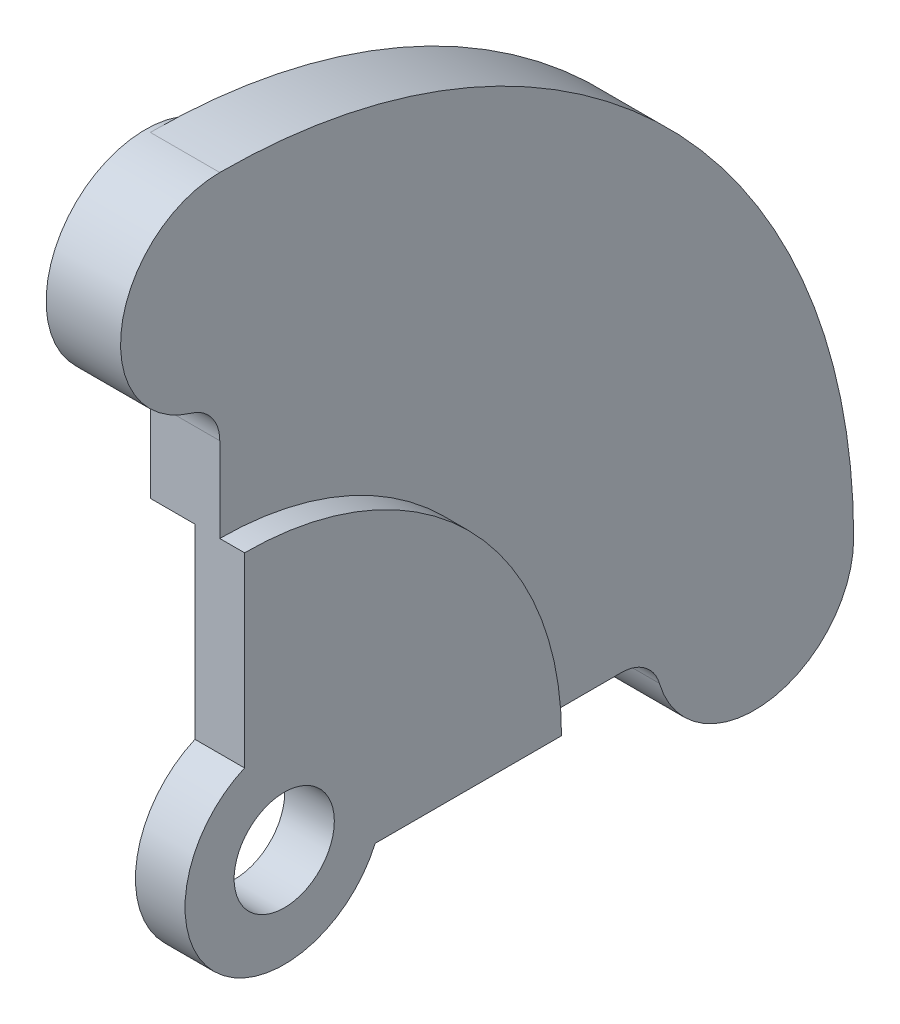
ISO-10303-21;
HEADER;
FILE_DESCRIPTION(('STEP AP214'),'2;1');
FILE_NAME('part.step','',(''),(''),'','','');
FILE_SCHEMA(('AUTOMOTIVE_DESIGN { 1 0 10303 214 1 1 1 1 }'));
ENDSEC;
DATA;
#1=APPLICATION_CONTEXT('core data for automotive mechanical design processes');
#2=APPLICATION_PROTOCOL_DEFINITION('international standard','automotive_design',2000,#1);
#3=PRODUCT_CONTEXT('',#1,'mechanical');
#4=PRODUCT('Part','Part','',(#3));
#5=PRODUCT_RELATED_PRODUCT_CATEGORY('part','',(#4));
#6=PRODUCT_DEFINITION_FORMATION('','',#4);
#7=PRODUCT_DEFINITION_CONTEXT('part definition',#1,'design');
#8=PRODUCT_DEFINITION('design','',#6,#7);
#9=PRODUCT_DEFINITION_SHAPE('','',#8);
#10=(LENGTH_UNIT() NAMED_UNIT(*) SI_UNIT(.MILLI.,.METRE.));
#11=(NAMED_UNIT(*) PLANE_ANGLE_UNIT() SI_UNIT($,.RADIAN.));
#12=(NAMED_UNIT(*) SI_UNIT($,.STERADIAN.) SOLID_ANGLE_UNIT());
#13=UNCERTAINTY_MEASURE_WITH_UNIT(LENGTH_MEASURE(1.E-05),#10,'distance_accuracy_value','');
#14=(GEOMETRIC_REPRESENTATION_CONTEXT(3) GLOBAL_UNCERTAINTY_ASSIGNED_CONTEXT((#13)) GLOBAL_UNIT_ASSIGNED_CONTEXT((#10,
#11,#12)) REPRESENTATION_CONTEXT('',''));
#15=CARTESIAN_POINT('',(0.,0.,0.));
#16=DIRECTION('',(0.,0.,1.));
#17=DIRECTION('',(1.,0.,0.));
#18=AXIS2_PLACEMENT_3D('',#15,#16,#17);
#19=CARTESIAN_POINT('',(2.5,0.,0.));
#20=DIRECTION('',(0.,1.,0.));
#21=DIRECTION('',(0.,0.,1.));
#22=AXIS2_PLACEMENT_3D('',#19,#20,#21);
#23=PLANE('',#22);
#24=DIRECTION('',(0.,0.,-1.));
#25=VECTOR('',#24,1.);
#26=CARTESIAN_POINT('',(2.5,0.,0.));
#27=LINE('',#26,#25);
#28=CARTESIAN_POINT('',(2.5,0.,-13.1651513899117));
#29=VERTEX_POINT('',#28);
#30=CARTESIAN_POINT('',(2.5,0.,-31.95));
#31=VERTEX_POINT('',#30);
#32=EDGE_CURVE('E156',#29,#31,#27,.T.);
#33=ORIENTED_EDGE('',*,*,#32,.F.);
#34=DIRECTION('',(1.,0.,0.));
#35=VECTOR('',#34,1.);
#36=CARTESIAN_POINT('',(-30.7842712474619,0.,-13.1651513899117));
#37=LINE('',#36,#35);
#38=CARTESIAN_POINT('',(-2.5,0.,-13.1651513899117));
#39=VERTEX_POINT('',#38);
#40=EDGE_CURVE('E141',#29,#39,#37,.F.);
#41=ORIENTED_EDGE('',*,*,#40,.T.);
#42=DIRECTION('',(0.,0.,-1.));
#43=VECTOR('',#42,1.);
#44=CARTESIAN_POINT('',(-2.5,0.,0.));
#45=LINE('',#44,#43);
#46=CARTESIAN_POINT('',(-2.5,0.,-31.95));
#47=VERTEX_POINT('',#46);
#48=EDGE_CURVE('E153',#39,#47,#45,.T.);
#49=ORIENTED_EDGE('',*,*,#48,.T.);
#50=DIRECTION('',(1.,0.,0.));
#51=VECTOR('',#50,1.);
#52=CARTESIAN_POINT('',(-7.,0.,-31.95));
#53=LINE('',#52,#51);
#54=CARTESIAN_POINT('',(-7.,0.,-31.95));
#55=VERTEX_POINT('',#54);
#56=EDGE_CURVE('E217',#55,#47,#53,.T.);
#57=ORIENTED_EDGE('',*,*,#56,.F.);
#58=DIRECTION('',(0.,0.,-1.));
#59=VECTOR('',#58,1.);
#60=CARTESIAN_POINT('',(-7.,0.,0.));
#61=LINE('',#60,#59);
#62=CARTESIAN_POINT('',(-7.,0.,-40.4835921350013));
#63=VERTEX_POINT('',#62);
#64=EDGE_CURVE('E256',#55,#63,#61,.T.);
#65=ORIENTED_EDGE('',*,*,#64,.T.);
#66=DIRECTION('',(1.,0.,0.));
#67=VECTOR('',#66,1.);
#68=CARTESIAN_POINT('',(2.5,0.,-40.4835921350013));
#69=LINE('',#68,#67);
#70=CARTESIAN_POINT('',(0.,0.,-40.4835921350013));
#71=VERTEX_POINT('',#70);
#72=EDGE_CURVE('E187',#63,#71,#69,.T.);
#73=ORIENTED_EDGE('',*,*,#72,.T.);
#74=DIRECTION('',(0.,0.,-1.));
#75=VECTOR('',#74,1.);
#76=CARTESIAN_POINT('',(0.,0.,0.));
#77=LINE('',#76,#75);
#78=CARTESIAN_POINT('',(0.,0.,-31.95));
#79=VERTEX_POINT('',#78);
#80=EDGE_CURVE('E235',#79,#71,#77,.T.);
#81=ORIENTED_EDGE('',*,*,#80,.F.);
#82=DIRECTION('',(-1.,0.,0.));
#83=VECTOR('',#82,1.);
#84=CARTESIAN_POINT('',(2.5,0.,-31.95));
#85=LINE('',#84,#83);
#86=EDGE_CURVE('E184',#31,#79,#85,.T.);
#87=ORIENTED_EDGE('',*,*,#86,.F.);
#88=EDGE_LOOP('',(#33,#41,#49,#57,#65,#73,#81,#87));
#89=FACE_BOUND('',#88,.T.);
#90=ADVANCED_FACE('F49',(#89),#23,.F.);
#91=CARTESIAN_POINT('',(2.5,0.,0.));
#92=DIRECTION('',(-1.,0.,0.));
#93=DIRECTION('',(0.,0.,1.));
#94=AXIS2_PLACEMENT_3D('',#91,#92,#93);
#95=CYLINDRICAL_SURFACE('',#94,31.95);
#96=ORIENTED_EDGE('',*,*,#86,.T.);
#97=CARTESIAN_POINT('',(0.,0.,0.));
#98=DIRECTION('',(1.,0.,0.));
#99=DIRECTION('',(0.,0.,-1.));
#100=AXIS2_PLACEMENT_3D('',#97,#98,#99);
#101=CIRCLE('',#100,31.95);
#102=CARTESIAN_POINT('',(0.,31.95,0.));
#103=VERTEX_POINT('',#102);
#104=EDGE_CURVE('E239',#79,#103,#101,.T.);
#105=ORIENTED_EDGE('',*,*,#104,.T.);
#106=DIRECTION('',(-1.,0.,0.));
#107=VECTOR('',#106,1.);
#108=CARTESIAN_POINT('',(2.5,31.95,0.));
#109=LINE('',#108,#107);
#110=CARTESIAN_POINT('',(2.5,31.95,0.));
#111=VERTEX_POINT('',#110);
#112=EDGE_CURVE('E180',#111,#103,#109,.T.);
#113=ORIENTED_EDGE('',*,*,#112,.F.);
#114=CARTESIAN_POINT('',(2.5,0.,0.));
#115=DIRECTION('',(1.,0.,0.));
#116=DIRECTION('',(0.,0.,-1.));
#117=AXIS2_PLACEMENT_3D('',#114,#115,#116);
#118=CIRCLE('',#117,31.95);
#119=EDGE_CURVE('E211',#31,#111,#118,.T.);
#120=ORIENTED_EDGE('',*,*,#119,.F.);
#121=EDGE_LOOP('',(#96,#105,#113,#120));
#122=FACE_BOUND('',#121,.T.);
#123=ADVANCED_FACE('F298',(#122),#95,.T.);
#124=CARTESIAN_POINT('',(2.5,0.,0.));
#125=DIRECTION('',(0.,0.,-1.));
#126=DIRECTION('',(-1.,0.,0.));
#127=AXIS2_PLACEMENT_3D('',#124,#125,#126);
#128=PLANE('',#127);
#129=DIRECTION('',(0.,-1.,0.));
#130=VECTOR('',#129,1.);
#131=CARTESIAN_POINT('',(-2.5,0.,0.));
#132=LINE('',#131,#130);
#133=CARTESIAN_POINT('',(-2.5,31.95,0.));
#134=VERTEX_POINT('',#133);
#135=CARTESIAN_POINT('',(-2.5,13.1651513899117,0.));
#136=VERTEX_POINT('',#135);
#137=EDGE_CURVE('E169',#134,#136,#132,.T.);
#138=ORIENTED_EDGE('',*,*,#137,.T.);
#139=DIRECTION('',(1.,0.,0.));
#140=VECTOR('',#139,1.);
#141=CARTESIAN_POINT('',(-30.7842712474619,13.1651513899117,0.));
#142=LINE('',#141,#140);
#143=CARTESIAN_POINT('',(2.5,13.1651513899117,0.));
#144=VERTEX_POINT('',#143);
#145=EDGE_CURVE('E144',#136,#144,#142,.T.);
#146=ORIENTED_EDGE('',*,*,#145,.T.);
#147=DIRECTION('',(0.,-1.,0.));
#148=VECTOR('',#147,1.);
#149=CARTESIAN_POINT('',(2.5,0.,0.));
#150=LINE('',#149,#148);
#151=EDGE_CURVE('E175',#111,#144,#150,.T.);
#152=ORIENTED_EDGE('',*,*,#151,.F.);
#153=ORIENTED_EDGE('',*,*,#112,.T.);
#154=DIRECTION('',(0.,-1.,0.));
#155=VECTOR('',#154,1.);
#156=CARTESIAN_POINT('',(0.,0.,0.));
#157=LINE('',#156,#155);
#158=CARTESIAN_POINT('',(0.,40.4835921350013,0.));
#159=VERTEX_POINT('',#158);
#160=EDGE_CURVE('E228',#159,#103,#157,.T.);
#161=ORIENTED_EDGE('',*,*,#160,.F.);
#162=DIRECTION('',(1.,0.,0.));
#163=VECTOR('',#162,1.);
#164=CARTESIAN_POINT('',(2.5,40.4835921350013,0.));
#165=LINE('',#164,#163);
#166=CARTESIAN_POINT('',(-7.,40.4835921350013,0.));
#167=VERTEX_POINT('',#166);
#168=EDGE_CURVE('E66',#159,#167,#165,.F.);
#169=ORIENTED_EDGE('',*,*,#168,.T.);
#170=DIRECTION('',(0.,-1.,0.));
#171=VECTOR('',#170,1.);
#172=CARTESIAN_POINT('',(-7.,0.,0.));
#173=LINE('',#172,#171);
#174=CARTESIAN_POINT('',(-7.,31.95,0.));
#175=VERTEX_POINT('',#174);
#176=EDGE_CURVE('E221',#167,#175,#173,.T.);
#177=ORIENTED_EDGE('',*,*,#176,.T.);
#178=DIRECTION('',(1.,0.,0.));
#179=VECTOR('',#178,1.);
#180=CARTESIAN_POINT('',(-7.,31.95,0.));
#181=LINE('',#180,#179);
#182=EDGE_CURVE('E165',#175,#134,#181,.T.);
#183=ORIENTED_EDGE('',*,*,#182,.T.);
#184=EDGE_LOOP('',(#138,#146,#152,#153,#161,#169,#177,#183));
#185=FACE_BOUND('',#184,.T.);
#186=ADVANCED_FACE('F305',(#185),#128,.F.);
#187=CARTESIAN_POINT('',(2.5,0.,0.));
#188=DIRECTION('',(1.,0.,0.));
#189=DIRECTION('',(0.,0.,-1.));
#190=AXIS2_PLACEMENT_3D('',#187,#188,#189);
#191=PLANE('',#190);
#192=CARTESIAN_POINT('',(2.5,4.,-4.));
#193=DIRECTION('',(1.,0.,0.));
#194=DIRECTION('',(0.,0.,-1.));
#195=AXIS2_PLACEMENT_3D('',#192,#193,#194);
#196=CIRCLE('',#195,5.05);
#197=CARTESIAN_POINT('',(2.5,4.,-9.05));
#198=VERTEX_POINT('',#197);
#199=EDGE_CURVE('E279',#198,#198,#196,.T.);
#200=ORIENTED_EDGE('',*,*,#199,.F.);
#201=EDGE_LOOP('',(#200));
#202=FACE_BOUND('',#201,.T.);
#203=CARTESIAN_POINT('',(2.5,4.,-4.));
#204=DIRECTION('',(1.,0.,0.));
#205=DIRECTION('',(0.,0.,-1.));
#206=AXIS2_PLACEMENT_3D('',#203,#204,#205);
#207=CIRCLE('',#206,10.);
#208=EDGE_CURVE('E149',#144,#29,#207,.T.);
#209=ORIENTED_EDGE('',*,*,#208,.T.);
#210=ORIENTED_EDGE('',*,*,#32,.T.);
#211=ORIENTED_EDGE('',*,*,#119,.T.);
#212=ORIENTED_EDGE('',*,*,#151,.T.);
#213=EDGE_LOOP('',(#209,#210,#211,#212));
#214=FACE_BOUND('',#213,.T.);
#215=ADVANCED_FACE('F367',(#202,#214),#191,.T.);
#216=CARTESIAN_POINT('',(-2.5,0.,0.));
#217=DIRECTION('',(1.,0.,0.));
#218=DIRECTION('',(0.,0.,-1.));
#219=AXIS2_PLACEMENT_3D('',#216,#217,#218);
#220=PLANE('',#219);
#221=CARTESIAN_POINT('',(-2.5,4.,-4.));
#222=DIRECTION('',(1.,0.,0.));
#223=DIRECTION('',(0.,0.,-1.));
#224=AXIS2_PLACEMENT_3D('',#221,#222,#223);
#225=CIRCLE('',#224,5.05);
#226=CARTESIAN_POINT('',(-2.5,4.,-9.05));
#227=VERTEX_POINT('',#226);
#228=EDGE_CURVE('E53',#227,#227,#225,.T.);
#229=ORIENTED_EDGE('',*,*,#228,.T.);
#230=EDGE_LOOP('',(#229));
#231=FACE_BOUND('',#230,.T.);
#232=ORIENTED_EDGE('',*,*,#48,.F.);
#233=CARTESIAN_POINT('',(-2.5,4.,-4.));
#234=DIRECTION('',(1.,0.,0.));
#235=DIRECTION('',(0.,0.,-1.));
#236=AXIS2_PLACEMENT_3D('',#233,#234,#235);
#237=CIRCLE('',#236,10.);
#238=EDGE_CURVE('E138',#39,#136,#237,.F.);
#239=ORIENTED_EDGE('',*,*,#238,.T.);
#240=ORIENTED_EDGE('',*,*,#137,.F.);
#241=CARTESIAN_POINT('',(-2.5,0.,0.));
#242=DIRECTION('',(1.,0.,0.));
#243=DIRECTION('',(0.,0.,-1.));
#244=AXIS2_PLACEMENT_3D('',#241,#242,#243);
#245=CIRCLE('',#244,31.95);
#246=EDGE_CURVE('E162',#47,#134,#245,.T.);
#247=ORIENTED_EDGE('',*,*,#246,.F.);
#248=EDGE_LOOP('',(#232,#239,#240,#247));
#249=FACE_BOUND('',#248,.T.);
#250=ADVANCED_FACE('F160',(#231,#249),#220,.F.);
#251=CARTESIAN_POINT('',(-7.,0.,0.));
#252=DIRECTION('',(1.,0.,0.));
#253=DIRECTION('',(0.,0.,-1.));
#254=AXIS2_PLACEMENT_3D('',#251,#252,#253);
#255=CYLINDRICAL_SURFACE('',#254,31.95);
#256=ORIENTED_EDGE('',*,*,#56,.T.);
#257=ORIENTED_EDGE('',*,*,#246,.T.);
#258=ORIENTED_EDGE('',*,*,#182,.F.);
#259=CARTESIAN_POINT('',(-7.,0.,0.));
#260=DIRECTION('',(1.,0.,0.));
#261=DIRECTION('',(0.,0.,-1.));
#262=AXIS2_PLACEMENT_3D('',#259,#260,#261);
#263=CIRCLE('',#262,31.95);
#264=EDGE_CURVE('E231',#55,#175,#263,.T.);
#265=ORIENTED_EDGE('',*,*,#264,.F.);
#266=EDGE_LOOP('',(#256,#257,#258,#265));
#267=FACE_BOUND('',#266,.T.);
#268=ADVANCED_FACE('F333',(#267),#255,.F.);
#269=CARTESIAN_POINT('',(-7.,0.,0.));
#270=DIRECTION('',(1.,0.,0.));
#271=DIRECTION('',(0.,0.,-1.));
#272=AXIS2_PLACEMENT_3D('',#269,#270,#271);
#273=CYLINDRICAL_SURFACE('',#272,63.9);
#274=CARTESIAN_POINT('',(0.,0.,0.));
#275=DIRECTION('',(1.,0.,0.));
#276=DIRECTION('',(0.,0.,-1.));
#277=AXIS2_PLACEMENT_3D('',#274,#275,#276);
#278=CIRCLE('',#277,63.9);
#279=CARTESIAN_POINT('',(0.,0.,-63.9));
#280=VERTEX_POINT('',#279);
#281=CARTESIAN_POINT('',(0.,63.9,0.));
#282=VERTEX_POINT('',#281);
#283=EDGE_CURVE('E232',#280,#282,#278,.T.);
#284=ORIENTED_EDGE('',*,*,#283,.F.);
#285=DIRECTION('',(1.,0.,0.));
#286=VECTOR('',#285,1.);
#287=CARTESIAN_POINT('',(-7.,0.,-63.9));
#288=LINE('',#287,#286);
#289=CARTESIAN_POINT('',(-7.,0.,-63.9));
#290=VERTEX_POINT('',#289);
#291=EDGE_CURVE('E220',#290,#280,#288,.T.);
#292=ORIENTED_EDGE('',*,*,#291,.F.);
#293=CARTESIAN_POINT('',(-7.,0.,0.));
#294=DIRECTION('',(1.,0.,0.));
#295=DIRECTION('',(0.,0.,-1.));
#296=AXIS2_PLACEMENT_3D('',#293,#294,#295);
#297=CIRCLE('',#296,63.9);
#298=CARTESIAN_POINT('',(-7.,63.9,0.));
#299=VERTEX_POINT('',#298);
#300=EDGE_CURVE('E249',#290,#299,#297,.T.);
#301=ORIENTED_EDGE('',*,*,#300,.T.);
#302=DIRECTION('',(1.,0.,0.));
#303=VECTOR('',#302,1.);
#304=CARTESIAN_POINT('',(-7.,63.9,0.));
#305=LINE('',#304,#303);
#306=EDGE_CURVE('E172',#299,#282,#305,.T.);
#307=ORIENTED_EDGE('',*,*,#306,.T.);
#308=EDGE_LOOP('',(#284,#292,#301,#307));
#309=FACE_BOUND('',#308,.T.);
#310=ADVANCED_FACE('F345',(#309),#273,.T.);
#311=CARTESIAN_POINT('',(-7.,0.,0.));
#312=DIRECTION('',(1.,0.,0.));
#313=DIRECTION('',(0.,0.,-1.));
#314=AXIS2_PLACEMENT_3D('',#311,#312,#313);
#315=PLANE('',#314);
#316=ORIENTED_EDGE('',*,*,#264,.T.);
#317=ORIENTED_EDGE('',*,*,#176,.F.);
#318=CARTESIAN_POINT('',(-7.,40.4835921350013,4.));
#319=DIRECTION('',(1.,0.,0.));
#320=DIRECTION('',(0.,0.,-1.));
#321=AXIS2_PLACEMENT_3D('',#318,#319,#320);
#322=CIRCLE('',#321,4.);
#323=CARTESIAN_POINT('',(-7.,44.3168515250009,2.85714285714286));
#324=VERTEX_POINT('',#323);
#325=EDGE_CURVE('E11',#167,#324,#322,.T.);
#326=ORIENTED_EDGE('',*,*,#325,.T.);
#327=CARTESIAN_POINT('',(-7.,53.9,0.));
#328=DIRECTION('',(1.,0.,0.));
#329=DIRECTION('',(0.,0.,-1.));
#330=AXIS2_PLACEMENT_3D('',#327,#328,#329);
#331=CIRCLE('',#330,10.);
#332=EDGE_CURVE('E246',#324,#299,#331,.T.);
#333=ORIENTED_EDGE('',*,*,#332,.T.);
#334=ORIENTED_EDGE('',*,*,#300,.F.);
#335=CARTESIAN_POINT('',(-7.,0.,-53.9));
#336=DIRECTION('',(1.,0.,0.));
#337=DIRECTION('',(0.,0.,-1.));
#338=AXIS2_PLACEMENT_3D('',#335,#336,#337);
#339=CIRCLE('',#338,10.);
#340=CARTESIAN_POINT('',(-7.,-2.85714285714286,-44.3168515250009));
#341=VERTEX_POINT('',#340);
#342=EDGE_CURVE('E253',#290,#341,#339,.T.);
#343=ORIENTED_EDGE('',*,*,#342,.T.);
#344=CARTESIAN_POINT('',(-7.,-4.,-40.4835921350013));
#345=DIRECTION('',(1.,0.,0.));
#346=DIRECTION('',(0.,0.,-1.));
#347=AXIS2_PLACEMENT_3D('',#344,#345,#346);
#348=CIRCLE('',#347,4.);
#349=EDGE_CURVE('E204',#341,#63,#348,.T.);
#350=ORIENTED_EDGE('',*,*,#349,.T.);
#351=ORIENTED_EDGE('',*,*,#64,.F.);
#352=EDGE_LOOP('',(#316,#317,#326,#333,#334,#343,#350,#351));
#353=FACE_BOUND('',#352,.T.);
#354=ADVANCED_FACE('F326',(#353),#315,.F.);
#355=CARTESIAN_POINT('',(0.,0.,0.));
#356=DIRECTION('',(1.,0.,0.));
#357=DIRECTION('',(0.,0.,-1.));
#358=AXIS2_PLACEMENT_3D('',#355,#356,#357);
#359=PLANE('',#358);
#360=ORIENTED_EDGE('',*,*,#104,.F.);
#361=ORIENTED_EDGE('',*,*,#80,.T.);
#362=CARTESIAN_POINT('',(0.,-4.,-40.4835921350013));
#363=DIRECTION('',(1.,0.,0.));
#364=DIRECTION('',(0.,0.,-1.));
#365=AXIS2_PLACEMENT_3D('',#362,#363,#364);
#366=CIRCLE('',#365,4.);
#367=CARTESIAN_POINT('',(0.,-2.85714285714286,-44.3168515250009));
#368=VERTEX_POINT('',#367);
#369=EDGE_CURVE('E201',#71,#368,#366,.F.);
#370=ORIENTED_EDGE('',*,*,#369,.T.);
#371=CARTESIAN_POINT('',(0.,0.,-53.9));
#372=DIRECTION('',(1.,0.,0.));
#373=DIRECTION('',(0.,0.,-1.));
#374=AXIS2_PLACEMENT_3D('',#371,#372,#373);
#375=CIRCLE('',#374,10.);
#376=EDGE_CURVE('E158',#368,#280,#375,.T.);
#377=ORIENTED_EDGE('',*,*,#376,.T.);
#378=ORIENTED_EDGE('',*,*,#283,.T.);
#379=CARTESIAN_POINT('',(0.,53.9,0.));
#380=DIRECTION('',(1.,0.,0.));
#381=DIRECTION('',(0.,0.,-1.));
#382=AXIS2_PLACEMENT_3D('',#379,#380,#381);
#383=CIRCLE('',#382,10.);
#384=CARTESIAN_POINT('',(0.,44.3168515250009,2.85714285714286));
#385=VERTEX_POINT('',#384);
#386=EDGE_CURVE('E263',#282,#385,#383,.T.);
#387=ORIENTED_EDGE('',*,*,#386,.T.);
#388=CARTESIAN_POINT('',(0.,40.4835921350013,4.));
#389=DIRECTION('',(1.,0.,0.));
#390=DIRECTION('',(0.,0.,-1.));
#391=AXIS2_PLACEMENT_3D('',#388,#389,#390);
#392=CIRCLE('',#391,4.);
#393=EDGE_CURVE('E59',#385,#159,#392,.F.);
#394=ORIENTED_EDGE('',*,*,#393,.T.);
#395=ORIENTED_EDGE('',*,*,#160,.T.);
#396=EDGE_LOOP('',(#360,#361,#370,#377,#378,#387,#394,#395));
#397=FACE_BOUND('',#396,.T.);
#398=ADVANCED_FACE('F341',(#397),#359,.T.);
#399=CARTESIAN_POINT('',(-7.5,53.9,0.));
#400=DIRECTION('',(1.,0.,0.));
#401=DIRECTION('',(0.,0.,-1.));
#402=AXIS2_PLACEMENT_3D('',#399,#400,#401);
#403=CYLINDRICAL_SURFACE('',#402,10.);
#404=CARTESIAN_POINT('',(-7.5,53.9,0.));
#405=DIRECTION('',(1.,0.,0.));
#406=DIRECTION('',(0.,0.,-1.));
#407=AXIS2_PLACEMENT_3D('',#404,#405,#406);
#408=CIRCLE('',#407,10.);
#409=CARTESIAN_POINT('',(-7.5,53.9,-10.));
#410=VERTEX_POINT('',#409);
#411=EDGE_CURVE('E243',#410,#410,#408,.T.);
#412=ORIENTED_EDGE('',*,*,#411,.T.);
#413=EDGE_LOOP('',(#412));
#414=FACE_BOUND('',#413,.T.);
#415=ORIENTED_EDGE('',*,*,#332,.F.);
#416=DIRECTION('',(1.,0.,0.));
#417=VECTOR('',#416,1.);
#418=CARTESIAN_POINT('',(-7.5,44.3168515250009,2.85714285714286));
#419=LINE('',#418,#417);
#420=EDGE_CURVE('E195',#324,#385,#419,.T.);
#421=ORIENTED_EDGE('',*,*,#420,.T.);
#422=ORIENTED_EDGE('',*,*,#386,.F.);
#423=ORIENTED_EDGE('',*,*,#306,.F.);
#424=EDGE_LOOP('',(#415,#421,#422,#423));
#425=FACE_BOUND('',#424,.T.);
#426=ADVANCED_FACE('F338',(#414,#425),#403,.T.);
#427=CARTESIAN_POINT('',(-7.5,0.,0.));
#428=DIRECTION('',(1.,0.,0.));
#429=DIRECTION('',(0.,0.,-1.));
#430=AXIS2_PLACEMENT_3D('',#427,#428,#429);
#431=PLANE('',#430);
#432=ORIENTED_EDGE('',*,*,#411,.F.);
#433=EDGE_LOOP('',(#432));
#434=FACE_BOUND('',#433,.T.);
#435=ADVANCED_FACE('F347',(#434),#431,.F.);
#436=CARTESIAN_POINT('',(-7.5,0.,-53.9));
#437=DIRECTION('',(1.,0.,0.));
#438=DIRECTION('',(0.,0.,-1.));
#439=AXIS2_PLACEMENT_3D('',#436,#437,#438);
#440=CYLINDRICAL_SURFACE('',#439,10.);
#441=CARTESIAN_POINT('',(-7.5,0.,-53.9));
#442=DIRECTION('',(1.,0.,0.));
#443=DIRECTION('',(0.,0.,-1.));
#444=AXIS2_PLACEMENT_3D('',#441,#442,#443);
#445=CIRCLE('',#444,10.);
#446=CARTESIAN_POINT('',(-7.5,0.,-63.9));
#447=VERTEX_POINT('',#446);
#448=EDGE_CURVE('E266',#447,#447,#445,.T.);
#449=ORIENTED_EDGE('',*,*,#448,.T.);
#450=EDGE_LOOP('',(#449));
#451=FACE_BOUND('',#450,.T.);
#452=ORIENTED_EDGE('',*,*,#376,.F.);
#453=DIRECTION('',(1.,0.,0.));
#454=VECTOR('',#453,1.);
#455=CARTESIAN_POINT('',(-7.5,-2.85714285714286,-44.3168515250009));
#456=LINE('',#455,#454);
#457=EDGE_CURVE('E191',#368,#341,#456,.F.);
#458=ORIENTED_EDGE('',*,*,#457,.T.);
#459=ORIENTED_EDGE('',*,*,#342,.F.);
#460=ORIENTED_EDGE('',*,*,#291,.T.);
#461=EDGE_LOOP('',(#452,#458,#459,#460));
#462=FACE_BOUND('',#461,.T.);
#463=ADVANCED_FACE('F318',(#451,#462),#440,.T.);
#464=CARTESIAN_POINT('',(-7.5,0.,0.));
#465=DIRECTION('',(1.,0.,0.));
#466=DIRECTION('',(0.,0.,-1.));
#467=AXIS2_PLACEMENT_3D('',#464,#465,#466);
#468=PLANE('',#467);
#469=ORIENTED_EDGE('',*,*,#448,.F.);
#470=EDGE_LOOP('',(#469));
#471=FACE_BOUND('',#470,.T.);
#472=ADVANCED_FACE('F311',(#471),#468,.F.);
#473=CARTESIAN_POINT('',(-7.5,-4.,-40.4835921350013));
#474=DIRECTION('',(1.,0.,0.));
#475=DIRECTION('',(0.,0.,-1.));
#476=AXIS2_PLACEMENT_3D('',#473,#474,#475);
#477=CYLINDRICAL_SURFACE('',#476,4.);
#478=ORIENTED_EDGE('',*,*,#349,.F.);
#479=ORIENTED_EDGE('',*,*,#457,.F.);
#480=ORIENTED_EDGE('',*,*,#369,.F.);
#481=ORIENTED_EDGE('',*,*,#72,.F.);
#482=EDGE_LOOP('',(#478,#479,#480,#481));
#483=FACE_BOUND('',#482,.T.);
#484=ADVANCED_FACE('F309',(#483),#477,.F.);
#485=CARTESIAN_POINT('',(-7.5,40.4835921350013,4.));
#486=DIRECTION('',(1.,0.,0.));
#487=DIRECTION('',(0.,0.,-1.));
#488=AXIS2_PLACEMENT_3D('',#485,#486,#487);
#489=CYLINDRICAL_SURFACE('',#488,4.);
#490=ORIENTED_EDGE('',*,*,#325,.F.);
#491=ORIENTED_EDGE('',*,*,#168,.F.);
#492=ORIENTED_EDGE('',*,*,#393,.F.);
#493=ORIENTED_EDGE('',*,*,#420,.F.);
#494=EDGE_LOOP('',(#490,#491,#492,#493));
#495=FACE_BOUND('',#494,.T.);
#496=ADVANCED_FACE('F51',(#495),#489,.F.);
#497=CARTESIAN_POINT('',(-30.7842712474619,4.,-4.));
#498=DIRECTION('',(1.,0.,0.));
#499=DIRECTION('',(0.,0.,-1.));
#500=AXIS2_PLACEMENT_3D('',#497,#498,#499);
#501=CYLINDRICAL_SURFACE('',#500,10.);
#502=ORIENTED_EDGE('',*,*,#40,.F.);
#503=ORIENTED_EDGE('',*,*,#208,.F.);
#504=ORIENTED_EDGE('',*,*,#145,.F.);
#505=ORIENTED_EDGE('',*,*,#238,.F.);
#506=EDGE_LOOP('',(#502,#503,#504,#505));
#507=FACE_BOUND('',#506,.T.);
#508=ADVANCED_FACE('F140',(#507),#501,.T.);
#509=CARTESIAN_POINT('',(-128.5,4.,-4.));
#510=DIRECTION('',(1.,0.,0.));
#511=DIRECTION('',(0.,0.,-1.));
#512=AXIS2_PLACEMENT_3D('',#509,#510,#511);
#513=CYLINDRICAL_SURFACE('',#512,5.05);
#514=ORIENTED_EDGE('',*,*,#199,.T.);
#515=EDGE_LOOP('',(#514));
#516=FACE_BOUND('',#515,.T.);
#517=ORIENTED_EDGE('',*,*,#228,.F.);
#518=EDGE_LOOP('',(#517));
#519=FACE_BOUND('',#518,.T.);
#520=ADVANCED_FACE('F289',(#516,#519),#513,.F.);
#521=CLOSED_SHELL('',(#90,#123,#186,#215,#250,#268,#310,#354,#398,#426,#435,#463,#472,#484,#496,
#508,#520));
#522=MANIFOLD_SOLID_BREP('B2',#521);
#523=ADVANCED_BREP_SHAPE_REPRESENTATION('',(#18,#522),#14);
#524=SHAPE_DEFINITION_REPRESENTATION(#9,#523);
ENDSEC;
END-ISO-10303-21;
